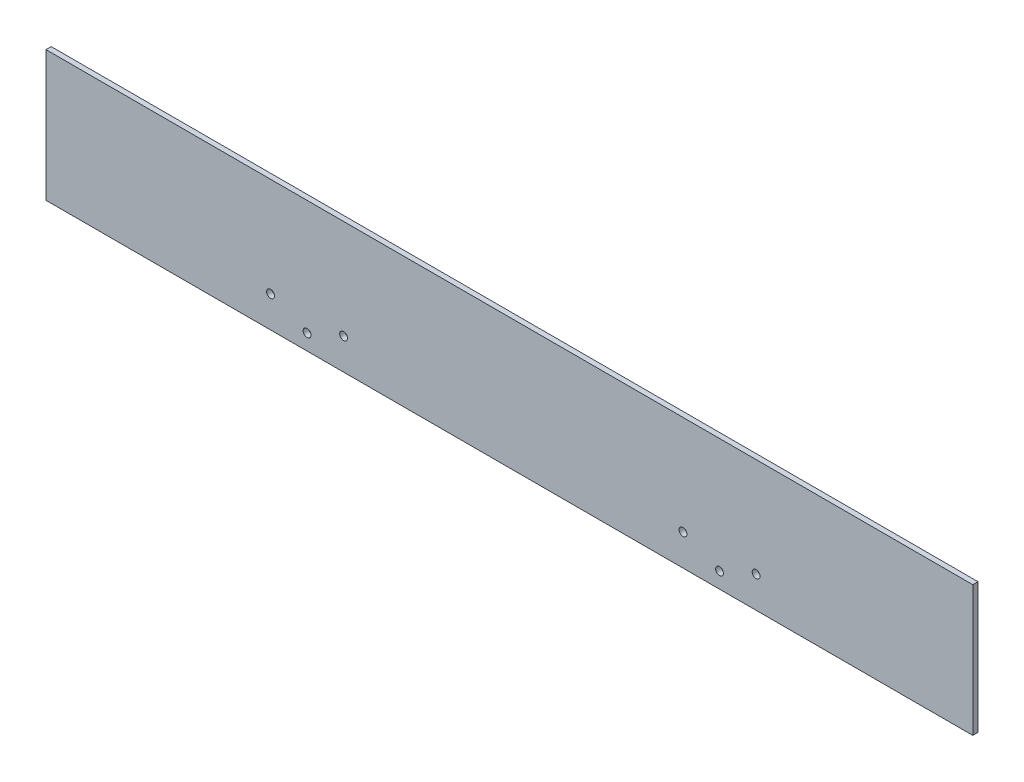
ISO-10303-21;
HEADER;
FILE_DESCRIPTION(('STEP AP214'),'2;1');
FILE_NAME('part.step','',(''),(''),'','','');
FILE_SCHEMA(('AUTOMOTIVE_DESIGN { 1 0 10303 214 1 1 1 1 }'));
ENDSEC;
DATA;
#1=APPLICATION_CONTEXT('core data for automotive mechanical design processes');
#2=APPLICATION_PROTOCOL_DEFINITION('international standard','automotive_design',2000,#1);
#3=PRODUCT_CONTEXT('',#1,'mechanical');
#4=PRODUCT('Part','Part','',(#3));
#5=PRODUCT_RELATED_PRODUCT_CATEGORY('part','',(#4));
#6=PRODUCT_DEFINITION_FORMATION('','',#4);
#7=PRODUCT_DEFINITION_CONTEXT('part definition',#1,'design');
#8=PRODUCT_DEFINITION('design','',#6,#7);
#9=PRODUCT_DEFINITION_SHAPE('','',#8);
#10=(LENGTH_UNIT() NAMED_UNIT(*) SI_UNIT(.MILLI.,.METRE.));
#11=(NAMED_UNIT(*) PLANE_ANGLE_UNIT() SI_UNIT($,.RADIAN.));
#12=(NAMED_UNIT(*) SI_UNIT($,.STERADIAN.) SOLID_ANGLE_UNIT());
#13=UNCERTAINTY_MEASURE_WITH_UNIT(LENGTH_MEASURE(1.E-05),#10,'distance_accuracy_value','');
#14=(GEOMETRIC_REPRESENTATION_CONTEXT(3) GLOBAL_UNCERTAINTY_ASSIGNED_CONTEXT((#13)) GLOBAL_UNIT_ASSIGNED_CONTEXT((#10,
#11,#12)) REPRESENTATION_CONTEXT('',''));
#15=CARTESIAN_POINT('',(0.,0.,0.));
#16=DIRECTION('',(0.,0.,1.));
#17=DIRECTION('',(1.,0.,0.));
#18=AXIS2_PLACEMENT_3D('',#15,#16,#17);
#19=CARTESIAN_POINT('',(177.5,25.,2.));
#20=DIRECTION('',(-1.,0.,0.));
#21=DIRECTION('',(0.,0.,1.));
#22=AXIS2_PLACEMENT_3D('',#19,#20,#21);
#23=PLANE('',#22);
#24=DIRECTION('',(0.,1.,0.));
#25=VECTOR('',#24,1.);
#26=CARTESIAN_POINT('',(177.5,25.,0.));
#27=LINE('',#26,#25);
#28=CARTESIAN_POINT('',(177.5,-25.,0.));
#29=VERTEX_POINT('',#28);
#30=CARTESIAN_POINT('',(177.5,25.,0.));
#31=VERTEX_POINT('',#30);
#32=EDGE_CURVE('E99',#29,#31,#27,.T.);
#33=ORIENTED_EDGE('',*,*,#32,.T.);
#34=DIRECTION('',(0.,0.,-1.));
#35=VECTOR('',#34,1.);
#36=CARTESIAN_POINT('',(177.5,25.,2.));
#37=LINE('',#36,#35);
#38=CARTESIAN_POINT('',(177.5,25.,2.));
#39=VERTEX_POINT('',#38);
#40=EDGE_CURVE('E11',#39,#31,#37,.T.);
#41=ORIENTED_EDGE('',*,*,#40,.F.);
#42=DIRECTION('',(0.,1.,0.));
#43=VECTOR('',#42,1.);
#44=CARTESIAN_POINT('',(177.5,25.,2.));
#45=LINE('',#44,#43);
#46=CARTESIAN_POINT('',(177.5,-25.,2.));
#47=VERTEX_POINT('',#46);
#48=EDGE_CURVE('E87',#47,#39,#45,.T.);
#49=ORIENTED_EDGE('',*,*,#48,.F.);
#50=DIRECTION('',(0.,0.,-1.));
#51=VECTOR('',#50,1.);
#52=CARTESIAN_POINT('',(177.5,-25.,2.));
#53=LINE('',#52,#51);
#54=EDGE_CURVE('E95',#47,#29,#53,.T.);
#55=ORIENTED_EDGE('',*,*,#54,.T.);
#56=EDGE_LOOP('',(#33,#41,#49,#55));
#57=FACE_BOUND('',#56,.T.);
#58=ADVANCED_FACE('F36',(#57),#23,.F.);
#59=CARTESIAN_POINT('',(-177.5,25.,2.));
#60=DIRECTION('',(0.,-1.,0.));
#61=DIRECTION('',(0.,0.,-1.));
#62=AXIS2_PLACEMENT_3D('',#59,#60,#61);
#63=PLANE('',#62);
#64=DIRECTION('',(-1.,0.,0.));
#65=VECTOR('',#64,1.);
#66=CARTESIAN_POINT('',(-177.5,25.,0.));
#67=LINE('',#66,#65);
#68=CARTESIAN_POINT('',(-177.5,25.,0.));
#69=VERTEX_POINT('',#68);
#70=EDGE_CURVE('E91',#31,#69,#67,.T.);
#71=ORIENTED_EDGE('',*,*,#70,.T.);
#72=DIRECTION('',(0.,0.,-1.));
#73=VECTOR('',#72,1.);
#74=CARTESIAN_POINT('',(-177.5,25.,2.));
#75=LINE('',#74,#73);
#76=CARTESIAN_POINT('',(-177.5,25.,2.));
#77=VERTEX_POINT('',#76);
#78=EDGE_CURVE('E44',#77,#69,#75,.T.);
#79=ORIENTED_EDGE('',*,*,#78,.F.);
#80=DIRECTION('',(-1.,0.,0.));
#81=VECTOR('',#80,1.);
#82=CARTESIAN_POINT('',(-177.5,25.,2.));
#83=LINE('',#82,#81);
#84=EDGE_CURVE('E82',#39,#77,#83,.T.);
#85=ORIENTED_EDGE('',*,*,#84,.F.);
#86=ORIENTED_EDGE('',*,*,#40,.T.);
#87=EDGE_LOOP('',(#71,#79,#85,#86));
#88=FACE_BOUND('',#87,.T.);
#89=ADVANCED_FACE('F90',(#88),#63,.F.);
#90=CARTESIAN_POINT('',(-177.5,25.,2.));
#91=DIRECTION('',(1.,0.,0.));
#92=DIRECTION('',(0.,1.,0.));
#93=AXIS2_PLACEMENT_3D('',#90,#91,#92);
#94=PLANE('',#93);
#95=DIRECTION('',(0.,-1.,0.));
#96=VECTOR('',#95,1.);
#97=CARTESIAN_POINT('',(-177.5,25.,0.));
#98=LINE('',#97,#96);
#99=CARTESIAN_POINT('',(-177.5,-25.,0.));
#100=VERTEX_POINT('',#99);
#101=EDGE_CURVE('E69',#69,#100,#98,.T.);
#102=ORIENTED_EDGE('',*,*,#101,.T.);
#103=DIRECTION('',(0.,0.,-1.));
#104=VECTOR('',#103,1.);
#105=CARTESIAN_POINT('',(-177.5,-25.,2.));
#106=LINE('',#105,#104);
#107=CARTESIAN_POINT('',(-177.5,-25.,2.));
#108=VERTEX_POINT('',#107);
#109=EDGE_CURVE('E92',#108,#100,#106,.T.);
#110=ORIENTED_EDGE('',*,*,#109,.F.);
#111=DIRECTION('',(0.,-1.,0.));
#112=VECTOR('',#111,1.);
#113=CARTESIAN_POINT('',(-177.5,25.,2.));
#114=LINE('',#113,#112);
#115=EDGE_CURVE('E85',#77,#108,#114,.T.);
#116=ORIENTED_EDGE('',*,*,#115,.F.);
#117=ORIENTED_EDGE('',*,*,#78,.T.);
#118=EDGE_LOOP('',(#102,#110,#116,#117));
#119=FACE_BOUND('',#118,.T.);
#120=ADVANCED_FACE('F93',(#119),#94,.F.);
#121=CARTESIAN_POINT('',(-177.5,-25.,2.));
#122=DIRECTION('',(0.,1.,0.));
#123=DIRECTION('',(0.,0.,1.));
#124=AXIS2_PLACEMENT_3D('',#121,#122,#123);
#125=PLANE('',#124);
#126=DIRECTION('',(1.,0.,0.));
#127=VECTOR('',#126,1.);
#128=CARTESIAN_POINT('',(-177.5,-25.,0.));
#129=LINE('',#128,#127);
#130=EDGE_CURVE('E75',#100,#29,#129,.T.);
#131=ORIENTED_EDGE('',*,*,#130,.T.);
#132=ORIENTED_EDGE('',*,*,#54,.F.);
#133=DIRECTION('',(1.,0.,0.));
#134=VECTOR('',#133,1.);
#135=CARTESIAN_POINT('',(-177.5,-25.,2.));
#136=LINE('',#135,#134);
#137=EDGE_CURVE('E52',#108,#47,#136,.T.);
#138=ORIENTED_EDGE('',*,*,#137,.F.);
#139=ORIENTED_EDGE('',*,*,#109,.T.);
#140=EDGE_LOOP('',(#131,#132,#138,#139));
#141=FACE_BOUND('',#140,.T.);
#142=ADVANCED_FACE('F107',(#141),#125,.F.);
#143=CARTESIAN_POINT('',(0.,0.,2.));
#144=DIRECTION('',(0.,0.,1.));
#145=DIRECTION('',(1.,0.,0.));
#146=AXIS2_PLACEMENT_3D('',#143,#144,#145);
#147=PLANE('',#146);
#148=CARTESIAN_POINT('',(94.5000000000001,-12.9999999999983,2.));
#149=DIRECTION('',(0.,0.,-1.));
#150=DIRECTION('',(-1.,0.,0.));
#151=AXIS2_PLACEMENT_3D('',#148,#149,#150);
#152=CIRCLE('',#151,1.5);
#153=CARTESIAN_POINT('',(93.0000000000001,-12.9999999999983,2.));
#154=VERTEX_POINT('',#153);
#155=EDGE_CURVE('E102',#154,#154,#152,.T.);
#156=ORIENTED_EDGE('',*,*,#155,.T.);
#157=EDGE_LOOP('',(#156));
#158=FACE_BOUND('',#157,.T.);
#159=CARTESIAN_POINT('',(80.5000000000001,-18.9999999999983,2.));
#160=DIRECTION('',(0.,0.,-1.));
#161=DIRECTION('',(-1.,0.,0.));
#162=AXIS2_PLACEMENT_3D('',#159,#160,#161);
#163=CIRCLE('',#162,1.5);
#164=CARTESIAN_POINT('',(79.0000000000001,-18.9999999999983,2.));
#165=VERTEX_POINT('',#164);
#166=EDGE_CURVE('E140',#165,#165,#163,.T.);
#167=ORIENTED_EDGE('',*,*,#166,.T.);
#168=EDGE_LOOP('',(#167));
#169=FACE_BOUND('',#168,.T.);
#170=CARTESIAN_POINT('',(66.5000000000001,-12.9999999999983,2.));
#171=DIRECTION('',(0.,0.,-1.));
#172=DIRECTION('',(-1.,0.,0.));
#173=AXIS2_PLACEMENT_3D('',#170,#171,#172);
#174=CIRCLE('',#173,1.50000000000001);
#175=CARTESIAN_POINT('',(65.,-12.9999999999983,2.));
#176=VERTEX_POINT('',#175);
#177=EDGE_CURVE('E134',#176,#176,#174,.T.);
#178=ORIENTED_EDGE('',*,*,#177,.T.);
#179=EDGE_LOOP('',(#178));
#180=FACE_BOUND('',#179,.T.);
#181=CARTESIAN_POINT('',(-77.4999999999999,-18.9999999999992,2.));
#182=DIRECTION('',(0.,0.,-1.));
#183=DIRECTION('',(-1.,0.,0.));
#184=AXIS2_PLACEMENT_3D('',#181,#182,#183);
#185=CIRCLE('',#184,1.50000000000001);
#186=CARTESIAN_POINT('',(-78.9999999999999,-18.9999999999992,2.));
#187=VERTEX_POINT('',#186);
#188=EDGE_CURVE('E128',#187,#187,#185,.T.);
#189=ORIENTED_EDGE('',*,*,#188,.T.);
#190=EDGE_LOOP('',(#189));
#191=FACE_BOUND('',#190,.T.);
#192=CARTESIAN_POINT('',(-63.4999999999999,-12.9999999999992,2.));
#193=DIRECTION('',(0.,0.,-1.));
#194=DIRECTION('',(-1.,0.,0.));
#195=AXIS2_PLACEMENT_3D('',#192,#193,#194);
#196=CIRCLE('',#195,1.50000000000001);
#197=CARTESIAN_POINT('',(-64.9999999999999,-12.9999999999992,2.));
#198=VERTEX_POINT('',#197);
#199=EDGE_CURVE('E122',#198,#198,#196,.T.);
#200=ORIENTED_EDGE('',*,*,#199,.T.);
#201=EDGE_LOOP('',(#200));
#202=FACE_BOUND('',#201,.T.);
#203=CARTESIAN_POINT('',(-91.4999999999999,-12.9999999999992,2.));
#204=DIRECTION('',(0.,0.,-1.));
#205=DIRECTION('',(-1.,0.,0.));
#206=AXIS2_PLACEMENT_3D('',#203,#204,#205);
#207=CIRCLE('',#206,1.5);
#208=CARTESIAN_POINT('',(-92.9999999999999,-12.9999999999992,2.));
#209=VERTEX_POINT('',#208);
#210=EDGE_CURVE('E116',#209,#209,#207,.T.);
#211=ORIENTED_EDGE('',*,*,#210,.T.);
#212=EDGE_LOOP('',(#211));
#213=FACE_BOUND('',#212,.T.);
#214=ORIENTED_EDGE('',*,*,#48,.T.);
#215=ORIENTED_EDGE('',*,*,#84,.T.);
#216=ORIENTED_EDGE('',*,*,#115,.T.);
#217=ORIENTED_EDGE('',*,*,#137,.T.);
#218=EDGE_LOOP('',(#214,#215,#216,#217));
#219=FACE_BOUND('',#218,.T.);
#220=ADVANCED_FACE('F83',(#158,#169,#180,#191,#202,#213,#219),#147,.T.);
#221=CARTESIAN_POINT('',(0.,0.,0.));
#222=DIRECTION('',(0.,0.,1.));
#223=DIRECTION('',(1.,0.,0.));
#224=AXIS2_PLACEMENT_3D('',#221,#222,#223);
#225=PLANE('',#224);
#226=CARTESIAN_POINT('',(94.5000000000001,-12.9999999999983,0.));
#227=DIRECTION('',(0.,0.,-1.));
#228=DIRECTION('',(-1.,0.,0.));
#229=AXIS2_PLACEMENT_3D('',#226,#227,#228);
#230=CIRCLE('',#229,1.5);
#231=CARTESIAN_POINT('',(93.0000000000001,-12.9999999999983,0.));
#232=VERTEX_POINT('',#231);
#233=EDGE_CURVE('E143',#232,#232,#230,.T.);
#234=ORIENTED_EDGE('',*,*,#233,.F.);
#235=EDGE_LOOP('',(#234));
#236=FACE_BOUND('',#235,.T.);
#237=CARTESIAN_POINT('',(80.5000000000001,-18.9999999999983,0.));
#238=DIRECTION('',(0.,0.,-1.));
#239=DIRECTION('',(-1.,0.,0.));
#240=AXIS2_PLACEMENT_3D('',#237,#238,#239);
#241=CIRCLE('',#240,1.5);
#242=CARTESIAN_POINT('',(79.0000000000001,-18.9999999999983,0.));
#243=VERTEX_POINT('',#242);
#244=EDGE_CURVE('E137',#243,#243,#241,.T.);
#245=ORIENTED_EDGE('',*,*,#244,.F.);
#246=EDGE_LOOP('',(#245));
#247=FACE_BOUND('',#246,.T.);
#248=CARTESIAN_POINT('',(66.5000000000001,-12.9999999999983,0.));
#249=DIRECTION('',(0.,0.,-1.));
#250=DIRECTION('',(-1.,0.,0.));
#251=AXIS2_PLACEMENT_3D('',#248,#249,#250);
#252=CIRCLE('',#251,1.50000000000001);
#253=CARTESIAN_POINT('',(65.,-12.9999999999983,0.));
#254=VERTEX_POINT('',#253);
#255=EDGE_CURVE('E131',#254,#254,#252,.T.);
#256=ORIENTED_EDGE('',*,*,#255,.F.);
#257=EDGE_LOOP('',(#256));
#258=FACE_BOUND('',#257,.T.);
#259=CARTESIAN_POINT('',(-77.4999999999999,-18.9999999999992,0.));
#260=DIRECTION('',(0.,0.,-1.));
#261=DIRECTION('',(-1.,0.,0.));
#262=AXIS2_PLACEMENT_3D('',#259,#260,#261);
#263=CIRCLE('',#262,1.50000000000001);
#264=CARTESIAN_POINT('',(-78.9999999999999,-18.9999999999992,0.));
#265=VERTEX_POINT('',#264);
#266=EDGE_CURVE('E125',#265,#265,#263,.T.);
#267=ORIENTED_EDGE('',*,*,#266,.F.);
#268=EDGE_LOOP('',(#267));
#269=FACE_BOUND('',#268,.T.);
#270=CARTESIAN_POINT('',(-63.4999999999999,-12.9999999999992,0.));
#271=DIRECTION('',(0.,0.,-1.));
#272=DIRECTION('',(-1.,0.,0.));
#273=AXIS2_PLACEMENT_3D('',#270,#271,#272);
#274=CIRCLE('',#273,1.50000000000001);
#275=CARTESIAN_POINT('',(-64.9999999999999,-12.9999999999992,0.));
#276=VERTEX_POINT('',#275);
#277=EDGE_CURVE('E119',#276,#276,#274,.T.);
#278=ORIENTED_EDGE('',*,*,#277,.F.);
#279=EDGE_LOOP('',(#278));
#280=FACE_BOUND('',#279,.T.);
#281=CARTESIAN_POINT('',(-91.4999999999999,-12.9999999999992,0.));
#282=DIRECTION('',(0.,0.,-1.));
#283=DIRECTION('',(-1.,0.,0.));
#284=AXIS2_PLACEMENT_3D('',#281,#282,#283);
#285=CIRCLE('',#284,1.5);
#286=CARTESIAN_POINT('',(-92.9999999999999,-12.9999999999992,0.));
#287=VERTEX_POINT('',#286);
#288=EDGE_CURVE('E113',#287,#287,#285,.T.);
#289=ORIENTED_EDGE('',*,*,#288,.F.);
#290=EDGE_LOOP('',(#289));
#291=FACE_BOUND('',#290,.T.);
#292=ORIENTED_EDGE('',*,*,#32,.F.);
#293=ORIENTED_EDGE('',*,*,#130,.F.);
#294=ORIENTED_EDGE('',*,*,#101,.F.);
#295=ORIENTED_EDGE('',*,*,#70,.F.);
#296=EDGE_LOOP('',(#292,#293,#294,#295));
#297=FACE_BOUND('',#296,.T.);
#298=ADVANCED_FACE('F110',(#236,#247,#258,#269,#280,#291,#297),#225,.F.);
#299=CARTESIAN_POINT('',(-91.4999999999999,-12.9999999999992,2.));
#300=DIRECTION('',(0.,0.,-1.));
#301=DIRECTION('',(-1.,0.,0.));
#302=AXIS2_PLACEMENT_3D('',#299,#300,#301);
#303=CYLINDRICAL_SURFACE('',#302,1.5);
#304=ORIENTED_EDGE('',*,*,#210,.F.);
#305=EDGE_LOOP('',(#304));
#306=FACE_BOUND('',#305,.T.);
#307=ORIENTED_EDGE('',*,*,#288,.T.);
#308=EDGE_LOOP('',(#307));
#309=FACE_BOUND('',#308,.T.);
#310=ADVANCED_FACE('F160',(#306,#309),#303,.F.);
#311=CARTESIAN_POINT('',(-63.4999999999999,-12.9999999999992,2.));
#312=DIRECTION('',(0.,0.,-1.));
#313=DIRECTION('',(-1.,0.,0.));
#314=AXIS2_PLACEMENT_3D('',#311,#312,#313);
#315=CYLINDRICAL_SURFACE('',#314,1.50000000000001);
#316=ORIENTED_EDGE('',*,*,#199,.F.);
#317=EDGE_LOOP('',(#316));
#318=FACE_BOUND('',#317,.T.);
#319=ORIENTED_EDGE('',*,*,#277,.T.);
#320=EDGE_LOOP('',(#319));
#321=FACE_BOUND('',#320,.T.);
#322=ADVANCED_FACE('F173',(#318,#321),#315,.F.);
#323=CARTESIAN_POINT('',(-77.4999999999999,-18.9999999999992,2.));
#324=DIRECTION('',(0.,0.,-1.));
#325=DIRECTION('',(-1.,0.,0.));
#326=AXIS2_PLACEMENT_3D('',#323,#324,#325);
#327=CYLINDRICAL_SURFACE('',#326,1.50000000000001);
#328=ORIENTED_EDGE('',*,*,#188,.F.);
#329=EDGE_LOOP('',(#328));
#330=FACE_BOUND('',#329,.T.);
#331=ORIENTED_EDGE('',*,*,#266,.T.);
#332=EDGE_LOOP('',(#331));
#333=FACE_BOUND('',#332,.T.);
#334=ADVANCED_FACE('F179',(#330,#333),#327,.F.);
#335=CARTESIAN_POINT('',(66.5000000000001,-12.9999999999983,2.));
#336=DIRECTION('',(0.,0.,-1.));
#337=DIRECTION('',(-1.,0.,0.));
#338=AXIS2_PLACEMENT_3D('',#335,#336,#337);
#339=CYLINDRICAL_SURFACE('',#338,1.50000000000001);
#340=ORIENTED_EDGE('',*,*,#177,.F.);
#341=EDGE_LOOP('',(#340));
#342=FACE_BOUND('',#341,.T.);
#343=ORIENTED_EDGE('',*,*,#255,.T.);
#344=EDGE_LOOP('',(#343));
#345=FACE_BOUND('',#344,.T.);
#346=ADVANCED_FACE('F222',(#342,#345),#339,.F.);
#347=CARTESIAN_POINT('',(80.5000000000001,-18.9999999999983,2.));
#348=DIRECTION('',(0.,0.,-1.));
#349=DIRECTION('',(-1.,0.,0.));
#350=AXIS2_PLACEMENT_3D('',#347,#348,#349);
#351=CYLINDRICAL_SURFACE('',#350,1.5);
#352=ORIENTED_EDGE('',*,*,#166,.F.);
#353=EDGE_LOOP('',(#352));
#354=FACE_BOUND('',#353,.T.);
#355=ORIENTED_EDGE('',*,*,#244,.T.);
#356=EDGE_LOOP('',(#355));
#357=FACE_BOUND('',#356,.T.);
#358=ADVANCED_FACE('F154',(#354,#357),#351,.F.);
#359=CARTESIAN_POINT('',(94.5000000000001,-12.9999999999983,2.));
#360=DIRECTION('',(0.,0.,-1.));
#361=DIRECTION('',(-1.,0.,0.));
#362=AXIS2_PLACEMENT_3D('',#359,#360,#361);
#363=CYLINDRICAL_SURFACE('',#362,1.5);
#364=ORIENTED_EDGE('',*,*,#155,.F.);
#365=EDGE_LOOP('',(#364));
#366=FACE_BOUND('',#365,.T.);
#367=ORIENTED_EDGE('',*,*,#233,.T.);
#368=EDGE_LOOP('',(#367));
#369=FACE_BOUND('',#368,.T.);
#370=ADVANCED_FACE('F151',(#366,#369),#363,.F.);
#371=CLOSED_SHELL('',(#58,#89,#120,#142,#220,#298,#310,#322,#334,#346,#358,#370));
#372=MANIFOLD_SOLID_BREP('B2',#371);
#373=ADVANCED_BREP_SHAPE_REPRESENTATION('',(#18,#372),#14);
#374=SHAPE_DEFINITION_REPRESENTATION(#9,#373);
ENDSEC;
END-ISO-10303-21;
